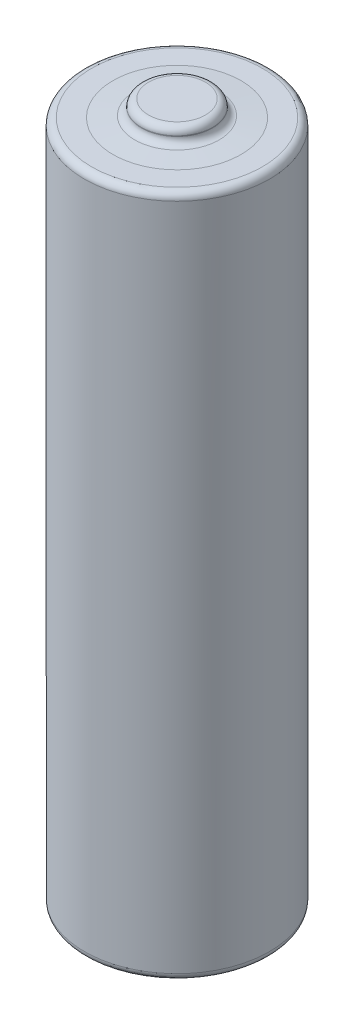
ISO-10303-21;
HEADER;
FILE_DESCRIPTION(('STEP AP214'),'2;1');
FILE_NAME('part.step','',(''),(''),'','','');
FILE_SCHEMA(('AUTOMOTIVE_DESIGN { 1 0 10303 214 1 1 1 1 }'));
ENDSEC;
DATA;
#1=APPLICATION_CONTEXT('core data for automotive mechanical design processes');
#2=APPLICATION_PROTOCOL_DEFINITION('international standard','automotive_design',2000,#1);
#3=PRODUCT_CONTEXT('',#1,'mechanical');
#4=PRODUCT('Part','Part','',(#3));
#5=PRODUCT_RELATED_PRODUCT_CATEGORY('part','',(#4));
#6=PRODUCT_DEFINITION_FORMATION('','',#4);
#7=PRODUCT_DEFINITION_CONTEXT('part definition',#1,'design');
#8=PRODUCT_DEFINITION('design','',#6,#7);
#9=PRODUCT_DEFINITION_SHAPE('','',#8);
#10=(LENGTH_UNIT() NAMED_UNIT(*) SI_UNIT(.MILLI.,.METRE.));
#11=(NAMED_UNIT(*) PLANE_ANGLE_UNIT() SI_UNIT($,.RADIAN.));
#12=(NAMED_UNIT(*) SI_UNIT($,.STERADIAN.) SOLID_ANGLE_UNIT());
#13=UNCERTAINTY_MEASURE_WITH_UNIT(LENGTH_MEASURE(1.E-05),#10,'distance_accuracy_value','');
#14=(GEOMETRIC_REPRESENTATION_CONTEXT(3) GLOBAL_UNCERTAINTY_ASSIGNED_CONTEXT((#13)) GLOBAL_UNIT_ASSIGNED_CONTEXT((#10,
#11,#12)) REPRESENTATION_CONTEXT('',''));
#15=CARTESIAN_POINT('',(0.,0.,0.));
#16=DIRECTION('',(0.,0.,1.));
#17=DIRECTION('',(1.,0.,0.));
#18=AXIS2_PLACEMENT_3D('',#15,#16,#17);
#19=CARTESIAN_POINT('',(0.,15.9161276663135,-2.08373494283186));
#20=DIRECTION('',(0.,1.,0.));
#21=DIRECTION('',(0.,0.,1.));
#22=AXIS2_PLACEMENT_3D('',#19,#20,#21);
#23=PLANE('',#22);
#24=CARTESIAN_POINT('',(0.,15.9161276663135,-2.08373494283186));
#25=DIRECTION('',(0.,1.,0.));
#26=DIRECTION('',(0.,0.,1.));
#27=AXIS2_PLACEMENT_3D('',#24,#25,#26);
#28=CIRCLE('',#27,2.);
#29=CARTESIAN_POINT('',(0.,15.9161276663135,-0.0837349428318623));
#30=VERTEX_POINT('',#29);
#31=EDGE_CURVE('E60',#30,#30,#28,.T.);
#32=ORIENTED_EDGE('',*,*,#31,.T.);
#33=EDGE_LOOP('',(#32));
#34=FACE_BOUND('',#33,.T.);
#35=ADVANCED_FACE('F31',(#34),#23,.T.);
#36=CARTESIAN_POINT('',(0.,-34.2364669045439,-2.08373494283186));
#37=DIRECTION('',(0.,-1.,0.));
#38=DIRECTION('',(0.,0.,-1.));
#39=AXIS2_PLACEMENT_3D('',#36,#37,#38);
#40=CYLINDRICAL_SURFACE('',#39,2.5);
#41=CARTESIAN_POINT('',(0.,15.4161276663135,-2.08373494283186));
#42=DIRECTION('',(0.,1.,0.));
#43=DIRECTION('',(0.,0.,1.));
#44=AXIS2_PLACEMENT_3D('',#41,#42,#43);
#45=CIRCLE('',#44,2.5);
#46=CARTESIAN_POINT('',(0.,15.4161276663135,0.416265057168138));
#47=VERTEX_POINT('',#46);
#48=EDGE_CURVE('E63',#47,#47,#45,.F.);
#49=ORIENTED_EDGE('',*,*,#48,.T.);
#50=EDGE_LOOP('',(#49));
#51=FACE_BOUND('',#50,.T.);
#52=CARTESIAN_POINT('',(0.,15.3794322307291,-2.08373494283186));
#53=DIRECTION('',(0.,-1.,0.));
#54=DIRECTION('',(0.,0.,-1.));
#55=AXIS2_PLACEMENT_3D('',#52,#53,#54);
#56=CIRCLE('',#55,2.5);
#57=CARTESIAN_POINT('',(0.,15.3794322307291,-4.58373494283186));
#58=VERTEX_POINT('',#57);
#59=EDGE_CURVE('E66',#58,#58,#56,.F.);
#60=ORIENTED_EDGE('',*,*,#59,.T.);
#61=EDGE_LOOP('',(#60));
#62=FACE_BOUND('',#61,.T.);
#63=ADVANCED_FACE('F93',(#51,#62),#40,.T.);
#64=CARTESIAN_POINT('',(0.,14.7635330954561,-2.08373494283186));
#65=DIRECTION('',(0.,-1.,0.));
#66=DIRECTION('',(0.,0.,-1.));
#67=AXIS2_PLACEMENT_3D('',#64,#65,#66);
#68=CONICAL_SURFACE('',#67,4.5,1.4946465755851);
#69=CARTESIAN_POINT('',(0.,14.8808812264772,-2.08373494283186));
#70=DIRECTION('',(0.,-1.,0.));
#71=DIRECTION('',(0.,0.,-1.));
#72=AXIS2_PLACEMENT_3D('',#69,#70,#71);
#73=CIRCLE('',#72,2.96196191172784);
#74=CARTESIAN_POINT('',(0.,14.8808812264772,-5.0456968545597));
#75=VERTEX_POINT('',#74);
#76=EDGE_CURVE('E42',#75,#75,#73,.T.);
#77=ORIENTED_EDGE('',*,*,#76,.T.);
#78=EDGE_LOOP('',(#77));
#79=FACE_BOUND('',#78,.T.);
#80=CARTESIAN_POINT('',(0.,14.7635330954561,-2.08373494283186));
#81=DIRECTION('',(0.,-1.,0.));
#82=DIRECTION('',(0.,0.,-1.));
#83=AXIS2_PLACEMENT_3D('',#80,#81,#82);
#84=CIRCLE('',#83,4.5);
#85=CARTESIAN_POINT('',(0.,14.7635330954561,-6.58373494283186));
#86=VERTEX_POINT('',#85);
#87=EDGE_CURVE('E69',#86,#86,#84,.T.);
#88=ORIENTED_EDGE('',*,*,#87,.F.);
#89=EDGE_LOOP('',(#88));
#90=FACE_BOUND('',#89,.T.);
#91=ADVANCED_FACE('F99',(#79,#90),#68,.T.);
#92=CARTESIAN_POINT('',(0.,14.7635330954561,-6.58373494283186));
#93=DIRECTION('',(0.,1.,0.));
#94=DIRECTION('',(0.,0.,1.));
#95=AXIS2_PLACEMENT_3D('',#92,#93,#94);
#96=PLANE('',#95);
#97=CARTESIAN_POINT('',(0.,14.7635330954561,-2.08373494283186));
#98=DIRECTION('',(0.,1.,0.));
#99=DIRECTION('',(0.,0.,1.));
#100=AXIS2_PLACEMENT_3D('',#97,#98,#99);
#101=CIRCLE('',#100,6.);
#102=CARTESIAN_POINT('',(0.,14.7635330954561,3.91626505716814));
#103=VERTEX_POINT('',#102);
#104=EDGE_CURVE('E46',#103,#103,#101,.T.);
#105=ORIENTED_EDGE('',*,*,#104,.T.);
#106=EDGE_LOOP('',(#105));
#107=FACE_BOUND('',#106,.T.);
#108=ORIENTED_EDGE('',*,*,#87,.T.);
#109=EDGE_LOOP('',(#108));
#110=FACE_BOUND('',#109,.T.);
#111=ADVANCED_FACE('F89',(#107,#110),#96,.T.);
#112=CARTESIAN_POINT('',(0.,-34.2364669045439,-2.08373494283186));
#113=DIRECTION('',(0.,-1.,0.));
#114=DIRECTION('',(0.,0.,-1.));
#115=AXIS2_PLACEMENT_3D('',#112,#113,#114);
#116=CYLINDRICAL_SURFACE('',#115,6.5);
#117=CARTESIAN_POINT('',(0.,-32.7364669045439,-2.08373494283186));
#118=DIRECTION('',(0.,-1.,0.));
#119=DIRECTION('',(0.,0.,-1.));
#120=AXIS2_PLACEMENT_3D('',#117,#118,#119);
#121=CIRCLE('',#120,6.5);
#122=CARTESIAN_POINT('',(0.,-32.7364669045439,-8.58373494283187));
#123=VERTEX_POINT('',#122);
#124=EDGE_CURVE('E51',#123,#123,#121,.F.);
#125=ORIENTED_EDGE('',*,*,#124,.T.);
#126=EDGE_LOOP('',(#125));
#127=FACE_BOUND('',#126,.T.);
#128=CARTESIAN_POINT('',(0.,14.2635330954561,-2.08373494283186));
#129=DIRECTION('',(0.,1.,0.));
#130=DIRECTION('',(0.,0.,1.));
#131=AXIS2_PLACEMENT_3D('',#128,#129,#130);
#132=CIRCLE('',#131,6.5);
#133=CARTESIAN_POINT('',(0.,14.2635330954561,4.41626505716814));
#134=VERTEX_POINT('',#133);
#135=EDGE_CURVE('E54',#134,#134,#132,.F.);
#136=ORIENTED_EDGE('',*,*,#135,.T.);
#137=EDGE_LOOP('',(#136));
#138=FACE_BOUND('',#137,.T.);
#139=ADVANCED_FACE('F80',(#127,#138),#116,.T.);
#140=CARTESIAN_POINT('',(0.,-33.2364669045439,-8.58373494283187));
#141=DIRECTION('',(0.,-1.,0.));
#142=DIRECTION('',(0.,0.,-1.));
#143=AXIS2_PLACEMENT_3D('',#140,#141,#142);
#144=PLANE('',#143);
#145=CARTESIAN_POINT('',(0.,-33.2364669045439,-2.08373494283186));
#146=DIRECTION('',(0.,-1.,0.));
#147=DIRECTION('',(0.,0.,-1.));
#148=AXIS2_PLACEMENT_3D('',#145,#146,#147);
#149=CIRCLE('',#148,6.);
#150=CARTESIAN_POINT('',(0.,-33.2364669045439,-8.08373494283187));
#151=VERTEX_POINT('',#150);
#152=EDGE_CURVE('E57',#151,#151,#149,.T.);
#153=ORIENTED_EDGE('',*,*,#152,.T.);
#154=EDGE_LOOP('',(#153));
#155=FACE_BOUND('',#154,.T.);
#156=CARTESIAN_POINT('',(0.,-33.2364669045439,-2.08373494283186));
#157=DIRECTION('',(0.,-1.,0.));
#158=DIRECTION('',(0.,0.,-1.));
#159=AXIS2_PLACEMENT_3D('',#156,#157,#158);
#160=CIRCLE('',#159,4.);
#161=CARTESIAN_POINT('',(0.,-33.2364669045439,-6.08373494283186));
#162=VERTEX_POINT('',#161);
#163=EDGE_CURVE('E72',#162,#162,#160,.T.);
#164=ORIENTED_EDGE('',*,*,#163,.F.);
#165=EDGE_LOOP('',(#164));
#166=FACE_BOUND('',#165,.T.);
#167=ADVANCED_FACE('F78',(#155,#166),#144,.T.);
#168=CARTESIAN_POINT('',(0.,-34.2364669045439,-2.08373494283186));
#169=DIRECTION('',(0.,-1.,0.));
#170=DIRECTION('',(0.,0.,-1.));
#171=AXIS2_PLACEMENT_3D('',#168,#169,#170);
#172=CYLINDRICAL_SURFACE('',#171,4.);
#173=CARTESIAN_POINT('',(0.,-33.7364669045439,-2.08373494283186));
#174=DIRECTION('',(0.,-1.,0.));
#175=DIRECTION('',(0.,0.,-1.));
#176=AXIS2_PLACEMENT_3D('',#173,#174,#175);
#177=CIRCLE('',#176,4.);
#178=CARTESIAN_POINT('',(0.,-33.7364669045439,-6.08373494283186));
#179=VERTEX_POINT('',#178);
#180=EDGE_CURVE('E11',#179,#179,#177,.F.);
#181=ORIENTED_EDGE('',*,*,#180,.T.);
#182=EDGE_LOOP('',(#181));
#183=FACE_BOUND('',#182,.T.);
#184=ORIENTED_EDGE('',*,*,#163,.T.);
#185=EDGE_LOOP('',(#184));
#186=FACE_BOUND('',#185,.T.);
#187=ADVANCED_FACE('F76',(#183,#186),#172,.T.);
#188=CARTESIAN_POINT('',(0.,-34.2364669045439,-6.08373494283186));
#189=DIRECTION('',(0.,-1.,0.));
#190=DIRECTION('',(0.,0.,-1.));
#191=AXIS2_PLACEMENT_3D('',#188,#189,#190);
#192=PLANE('',#191);
#193=CARTESIAN_POINT('',(0.,-34.2364669045439,-2.08373494283186));
#194=DIRECTION('',(0.,-1.,0.));
#195=DIRECTION('',(0.,0.,-1.));
#196=AXIS2_PLACEMENT_3D('',#193,#194,#195);
#197=CIRCLE('',#196,3.5);
#198=CARTESIAN_POINT('',(0.,-34.2364669045439,-5.58373494283186));
#199=VERTEX_POINT('',#198);
#200=EDGE_CURVE('E38',#199,#199,#197,.T.);
#201=ORIENTED_EDGE('',*,*,#200,.T.);
#202=EDGE_LOOP('',(#201));
#203=FACE_BOUND('',#202,.T.);
#204=ADVANCED_FACE('F87',(#203),#192,.T.);
#205=CARTESIAN_POINT('',(0.,15.4161276663135,-2.08373494283186));
#206=DIRECTION('',(0.,1.,0.));
#207=DIRECTION('',(0.,0.,1.));
#208=AXIS2_PLACEMENT_3D('',#205,#206,#207);
#209=TOROIDAL_SURFACE('',#208,2.,0.5);
#210=ORIENTED_EDGE('',*,*,#31,.F.);
#211=EDGE_LOOP('',(#210));
#212=FACE_BOUND('',#211,.T.);
#213=ORIENTED_EDGE('',*,*,#48,.F.);
#214=EDGE_LOOP('',(#213));
#215=FACE_BOUND('',#214,.T.);
#216=ADVANCED_FACE('F104',(#212,#215),#209,.T.);
#217=CARTESIAN_POINT('',(0.,-32.7364669045439,-2.08373494283186));
#218=DIRECTION('',(0.,-1.,0.));
#219=DIRECTION('',(0.,0.,-1.));
#220=AXIS2_PLACEMENT_3D('',#217,#218,#219);
#221=TOROIDAL_SURFACE('',#220,6.,0.5);
#222=ORIENTED_EDGE('',*,*,#124,.F.);
#223=EDGE_LOOP('',(#222));
#224=FACE_BOUND('',#223,.T.);
#225=ORIENTED_EDGE('',*,*,#152,.F.);
#226=EDGE_LOOP('',(#225));
#227=FACE_BOUND('',#226,.T.);
#228=ADVANCED_FACE('F107',(#224,#227),#221,.T.);
#229=CARTESIAN_POINT('',(0.,14.2635330954561,-2.08373494283186));
#230=DIRECTION('',(0.,1.,0.));
#231=DIRECTION('',(0.,0.,1.));
#232=AXIS2_PLACEMENT_3D('',#229,#230,#231);
#233=TOROIDAL_SURFACE('',#232,6.,0.5);
#234=ORIENTED_EDGE('',*,*,#104,.F.);
#235=EDGE_LOOP('',(#234));
#236=FACE_BOUND('',#235,.T.);
#237=ORIENTED_EDGE('',*,*,#135,.F.);
#238=EDGE_LOOP('',(#237));
#239=FACE_BOUND('',#238,.T.);
#240=ADVANCED_FACE('F111',(#236,#239),#233,.T.);
#241=CARTESIAN_POINT('',(0.,15.3794322307291,-2.08373494283186));
#242=DIRECTION('',(0.,-1.,0.));
#243=DIRECTION('',(0.,0.,-1.));
#244=AXIS2_PLACEMENT_3D('',#241,#242,#243);
#245=TOROIDAL_SURFACE('',#244,3.,0.5);
#246=ORIENTED_EDGE('',*,*,#59,.F.);
#247=EDGE_LOOP('',(#246));
#248=FACE_BOUND('',#247,.T.);
#249=ORIENTED_EDGE('',*,*,#76,.F.);
#250=EDGE_LOOP('',(#249));
#251=FACE_BOUND('',#250,.T.);
#252=ADVANCED_FACE('F114',(#248,#251),#245,.F.);
#253=CARTESIAN_POINT('',(0.,-33.7364669045439,-2.08373494283186));
#254=DIRECTION('',(0.,-1.,0.));
#255=DIRECTION('',(0.,0.,-1.));
#256=AXIS2_PLACEMENT_3D('',#253,#254,#255);
#257=TOROIDAL_SURFACE('',#256,3.5,0.5);
#258=ORIENTED_EDGE('',*,*,#180,.F.);
#259=EDGE_LOOP('',(#258));
#260=FACE_BOUND('',#259,.T.);
#261=ORIENTED_EDGE('',*,*,#200,.F.);
#262=EDGE_LOOP('',(#261));
#263=FACE_BOUND('',#262,.T.);
#264=ADVANCED_FACE('F33',(#260,#263),#257,.T.);
#265=CLOSED_SHELL('',(#35,#63,#91,#111,#139,#167,#187,#204,#216,#228,#240,#252,#264));
#266=MANIFOLD_SOLID_BREP('B2',#265);
#267=ADVANCED_BREP_SHAPE_REPRESENTATION('',(#18,#266),#14);
#268=SHAPE_DEFINITION_REPRESENTATION(#9,#267);
ENDSEC;
END-ISO-10303-21;
